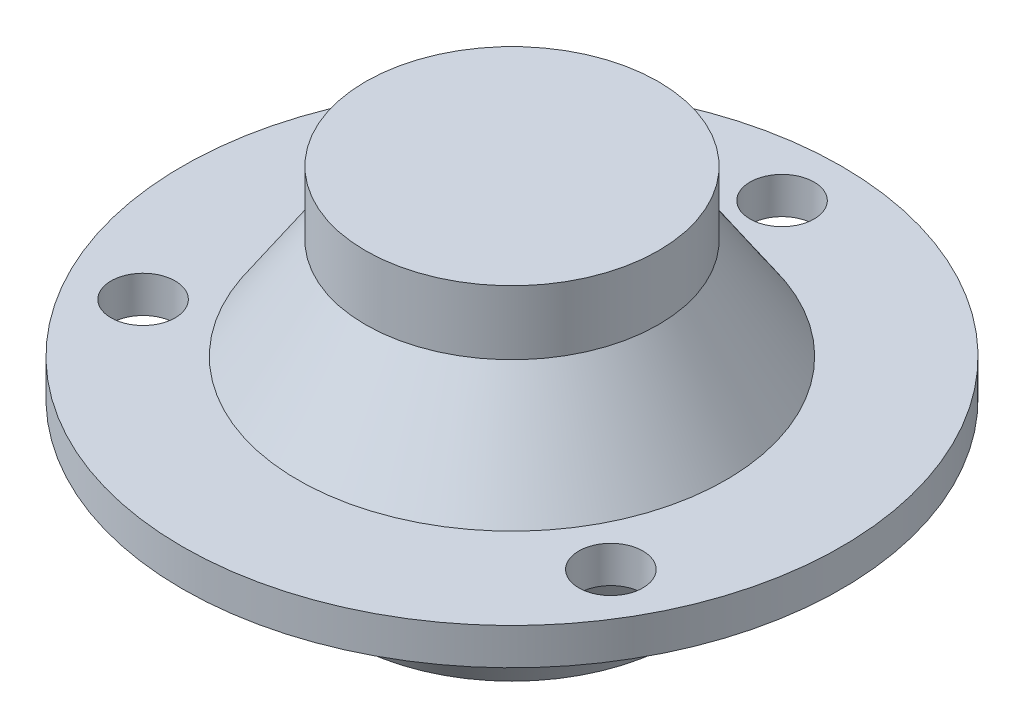
ISO-10303-21;
HEADER;
FILE_DESCRIPTION(('STEP AP214'),'2;1');
FILE_NAME('part.step','',(''),(''),'','','');
FILE_SCHEMA(('AUTOMOTIVE_DESIGN { 1 0 10303 214 1 1 1 1 }'));
ENDSEC;
DATA;
#1=APPLICATION_CONTEXT('core data for automotive mechanical design processes');
#2=APPLICATION_PROTOCOL_DEFINITION('international standard','automotive_design',2000,#1);
#3=PRODUCT_CONTEXT('',#1,'mechanical');
#4=PRODUCT('Part','Part','',(#3));
#5=PRODUCT_RELATED_PRODUCT_CATEGORY('part','',(#4));
#6=PRODUCT_DEFINITION_FORMATION('','',#4);
#7=PRODUCT_DEFINITION_CONTEXT('part definition',#1,'design');
#8=PRODUCT_DEFINITION('design','',#6,#7);
#9=PRODUCT_DEFINITION_SHAPE('','',#8);
#10=(LENGTH_UNIT() NAMED_UNIT(*) SI_UNIT(.MILLI.,.METRE.));
#11=(NAMED_UNIT(*) PLANE_ANGLE_UNIT() SI_UNIT($,.RADIAN.));
#12=(NAMED_UNIT(*) SI_UNIT($,.STERADIAN.) SOLID_ANGLE_UNIT());
#13=UNCERTAINTY_MEASURE_WITH_UNIT(LENGTH_MEASURE(1.E-05),#10,'distance_accuracy_value','');
#14=(GEOMETRIC_REPRESENTATION_CONTEXT(3) GLOBAL_UNCERTAINTY_ASSIGNED_CONTEXT((#13)) GLOBAL_UNIT_ASSIGNED_CONTEXT((#10,
#11,#12)) REPRESENTATION_CONTEXT('',''));
#15=CARTESIAN_POINT('',(0.,0.,0.));
#16=DIRECTION('',(0.,0.,1.));
#17=DIRECTION('',(1.,0.,0.));
#18=AXIS2_PLACEMENT_3D('',#15,#16,#17);
#19=CARTESIAN_POINT('',(9.,-9.,0.));
#20=DIRECTION('',(0.,-1.,0.));
#21=DIRECTION('',(0.,0.,-1.));
#22=AXIS2_PLACEMENT_3D('',#19,#20,#21);
#23=PLANE('',#22);
#24=CARTESIAN_POINT('',(0.,-9.,0.));
#25=DIRECTION('',(0.,-1.,0.));
#26=DIRECTION('',(0.,0.,-1.));
#27=AXIS2_PLACEMENT_3D('',#24,#25,#26);
#28=CIRCLE('',#27,8.);
#29=CARTESIAN_POINT('',(0.,-9.,-8.));
#30=VERTEX_POINT('',#29);
#31=EDGE_CURVE('E51',#30,#30,#28,.F.);
#32=ORIENTED_EDGE('',*,*,#31,.T.);
#33=EDGE_LOOP('',(#32));
#34=FACE_BOUND('',#33,.T.);
#35=CARTESIAN_POINT('',(0.,-9.,0.));
#36=DIRECTION('',(0.,-1.,0.));
#37=DIRECTION('',(0.,0.,-1.));
#38=AXIS2_PLACEMENT_3D('',#35,#36,#37);
#39=CIRCLE('',#38,9.);
#40=CARTESIAN_POINT('',(0.,-9.,-9.));
#41=VERTEX_POINT('',#40);
#42=EDGE_CURVE('E54',#41,#41,#39,.T.);
#43=ORIENTED_EDGE('',*,*,#42,.T.);
#44=EDGE_LOOP('',(#43));
#45=FACE_BOUND('',#44,.T.);
#46=ADVANCED_FACE('F35',(#34,#45),#23,.T.);
#47=CARTESIAN_POINT('',(0.,9.,0.));
#48=DIRECTION('',(0.,1.,0.));
#49=DIRECTION('',(0.,0.,1.));
#50=AXIS2_PLACEMENT_3D('',#47,#48,#49);
#51=PLANE('',#50);
#52=CARTESIAN_POINT('',(0.,9.,0.));
#53=DIRECTION('',(0.,-1.,0.));
#54=DIRECTION('',(0.,0.,-1.));
#55=AXIS2_PLACEMENT_3D('',#52,#53,#54);
#56=CIRCLE('',#55,8.);
#57=CARTESIAN_POINT('',(0.,9.,-8.));
#58=VERTEX_POINT('',#57);
#59=EDGE_CURVE('E10',#58,#58,#56,.T.);
#60=ORIENTED_EDGE('',*,*,#59,.F.);
#61=EDGE_LOOP('',(#60));
#62=FACE_BOUND('',#61,.T.);
#63=ADVANCED_FACE('F102',(#62),#51,.T.);
#64=CARTESIAN_POINT('',(0.,0.,0.));
#65=DIRECTION('',(0.,-1.,0.));
#66=DIRECTION('',(0.,0.,-1.));
#67=AXIS2_PLACEMENT_3D('',#64,#65,#66);
#68=CYLINDRICAL_SURFACE('',#67,8.);
#69=ORIENTED_EDGE('',*,*,#59,.T.);
#70=EDGE_LOOP('',(#69));
#71=FACE_BOUND('',#70,.T.);
#72=CARTESIAN_POINT('',(0.,5.5,0.));
#73=DIRECTION('',(0.,-1.,0.));
#74=DIRECTION('',(0.,0.,-1.));
#75=AXIS2_PLACEMENT_3D('',#72,#73,#74);
#76=CIRCLE('',#75,8.);
#77=CARTESIAN_POINT('',(0.,5.5,-8.));
#78=VERTEX_POINT('',#77);
#79=EDGE_CURVE('E42',#78,#78,#76,.T.);
#80=ORIENTED_EDGE('',*,*,#79,.F.);
#81=EDGE_LOOP('',(#80));
#82=FACE_BOUND('',#81,.T.);
#83=ADVANCED_FACE('F92',(#71,#82),#68,.T.);
#84=CARTESIAN_POINT('',(0.,0.,0.));
#85=DIRECTION('',(0.,-1.,0.));
#86=DIRECTION('',(0.,0.,-1.));
#87=AXIS2_PLACEMENT_3D('',#84,#85,#86);
#88=CONICAL_SURFACE('',#87,11.69,0.590933918434742);
#89=ORIENTED_EDGE('',*,*,#79,.T.);
#90=EDGE_LOOP('',(#89));
#91=FACE_BOUND('',#90,.T.);
#92=CARTESIAN_POINT('',(0.,0.,0.));
#93=DIRECTION('',(0.,-1.,0.));
#94=DIRECTION('',(0.,0.,-1.));
#95=AXIS2_PLACEMENT_3D('',#92,#93,#94);
#96=CIRCLE('',#95,11.69);
#97=CARTESIAN_POINT('',(0.,0.,-11.69));
#98=VERTEX_POINT('',#97);
#99=EDGE_CURVE('E47',#98,#98,#96,.T.);
#100=ORIENTED_EDGE('',*,*,#99,.F.);
#101=EDGE_LOOP('',(#100));
#102=FACE_BOUND('',#101,.T.);
#103=ADVANCED_FACE('F90',(#91,#102),#88,.T.);
#104=CARTESIAN_POINT('',(11.69,0.,0.));
#105=DIRECTION('',(0.,1.,0.));
#106=DIRECTION('',(0.,0.,1.));
#107=AXIS2_PLACEMENT_3D('',#104,#105,#106);
#108=PLANE('',#107);
#109=CARTESIAN_POINT('',(-12.7738747058204,0.,7.37500000000006));
#110=DIRECTION('',(0.,1.,0.));
#111=DIRECTION('',(0.866025403784436,0.,-0.500000000000004));
#112=AXIS2_PLACEMENT_3D('',#109,#110,#111);
#113=CIRCLE('',#112,1.75);
#114=CARTESIAN_POINT('',(-11.2583302491977,0.,6.50000000000006));
#115=VERTEX_POINT('',#114);
#116=EDGE_CURVE('E60',#115,#115,#113,.T.);
#117=ORIENTED_EDGE('',*,*,#116,.F.);
#118=EDGE_LOOP('',(#117));
#119=FACE_BOUND('',#118,.T.);
#120=CARTESIAN_POINT('',(12.7738747058205,0.,7.37499999999988));
#121=DIRECTION('',(0.,1.,0.));
#122=DIRECTION('',(-0.866025403784443,0.,-0.499999999999992));
#123=AXIS2_PLACEMENT_3D('',#120,#121,#122);
#124=CIRCLE('',#123,1.75);
#125=CARTESIAN_POINT('',(11.2583302491978,0.,6.4999999999999));
#126=VERTEX_POINT('',#125);
#127=EDGE_CURVE('E65',#126,#126,#124,.T.);
#128=ORIENTED_EDGE('',*,*,#127,.F.);
#129=EDGE_LOOP('',(#128));
#130=FACE_BOUND('',#129,.T.);
#131=CARTESIAN_POINT('',(0.,0.,-14.75));
#132=DIRECTION('',(0.,1.,0.));
#133=DIRECTION('',(0.,0.,1.));
#134=AXIS2_PLACEMENT_3D('',#131,#132,#133);
#135=CIRCLE('',#134,1.75);
#136=CARTESIAN_POINT('',(0.,0.,-13.));
#137=VERTEX_POINT('',#136);
#138=EDGE_CURVE('E57',#137,#137,#135,.T.);
#139=ORIENTED_EDGE('',*,*,#138,.F.);
#140=EDGE_LOOP('',(#139));
#141=FACE_BOUND('',#140,.T.);
#142=ORIENTED_EDGE('',*,*,#99,.T.);
#143=EDGE_LOOP('',(#142));
#144=FACE_BOUND('',#143,.T.);
#145=CARTESIAN_POINT('',(0.,0.,0.));
#146=DIRECTION('',(0.,-1.,0.));
#147=DIRECTION('',(0.,0.,-1.));
#148=AXIS2_PLACEMENT_3D('',#145,#146,#147);
#149=CIRCLE('',#148,18.);
#150=CARTESIAN_POINT('',(0.,0.,-18.));
#151=VERTEX_POINT('',#150);
#152=EDGE_CURVE('E82',#151,#151,#149,.T.);
#153=ORIENTED_EDGE('',*,*,#152,.F.);
#154=EDGE_LOOP('',(#153));
#155=FACE_BOUND('',#154,.T.);
#156=ADVANCED_FACE('F87',(#119,#130,#141,#144,#155),#108,.T.);
#157=CARTESIAN_POINT('',(0.,0.,0.));
#158=DIRECTION('',(0.,-1.,0.));
#159=DIRECTION('',(0.,0.,-1.));
#160=AXIS2_PLACEMENT_3D('',#157,#158,#159);
#161=CYLINDRICAL_SURFACE('',#160,18.);
#162=ORIENTED_EDGE('',*,*,#152,.T.);
#163=EDGE_LOOP('',(#162));
#164=FACE_BOUND('',#163,.T.);
#165=CARTESIAN_POINT('',(0.,-2.,0.));
#166=DIRECTION('',(0.,-1.,0.));
#167=DIRECTION('',(0.,0.,-1.));
#168=AXIS2_PLACEMENT_3D('',#165,#166,#167);
#169=CIRCLE('',#168,18.);
#170=CARTESIAN_POINT('',(0.,-2.,-18.));
#171=VERTEX_POINT('',#170);
#172=EDGE_CURVE('E79',#171,#171,#169,.T.);
#173=ORIENTED_EDGE('',*,*,#172,.F.);
#174=EDGE_LOOP('',(#173));
#175=FACE_BOUND('',#174,.T.);
#176=ADVANCED_FACE('F99',(#164,#175),#161,.T.);
#177=CARTESIAN_POINT('',(18.,-2.,0.));
#178=DIRECTION('',(0.,-1.,0.));
#179=DIRECTION('',(0.,0.,-1.));
#180=AXIS2_PLACEMENT_3D('',#177,#178,#179);
#181=PLANE('',#180);
#182=CARTESIAN_POINT('',(-12.7738747058204,-2.,7.37500000000006));
#183=DIRECTION('',(0.,-1.,0.));
#184=DIRECTION('',(0.,0.,-1.));
#185=AXIS2_PLACEMENT_3D('',#182,#183,#184);
#186=CIRCLE('',#185,1.75);
#187=CARTESIAN_POINT('',(-12.7738747058204,-2.,5.62500000000006));
#188=VERTEX_POINT('',#187);
#189=EDGE_CURVE('E38',#188,#188,#186,.T.);
#190=ORIENTED_EDGE('',*,*,#189,.F.);
#191=EDGE_LOOP('',(#190));
#192=FACE_BOUND('',#191,.T.);
#193=CARTESIAN_POINT('',(12.7738747058205,-2.,7.37499999999988));
#194=DIRECTION('',(0.,-1.,0.));
#195=DIRECTION('',(0.,0.,-1.));
#196=AXIS2_PLACEMENT_3D('',#193,#194,#195);
#197=CIRCLE('',#196,1.75);
#198=CARTESIAN_POINT('',(12.7738747058205,-2.,5.62499999999988));
#199=VERTEX_POINT('',#198);
#200=EDGE_CURVE('E58',#199,#199,#197,.T.);
#201=ORIENTED_EDGE('',*,*,#200,.F.);
#202=EDGE_LOOP('',(#201));
#203=FACE_BOUND('',#202,.T.);
#204=CARTESIAN_POINT('',(0.,-2.,-14.75));
#205=DIRECTION('',(0.,-1.,0.));
#206=DIRECTION('',(0.,0.,-1.));
#207=AXIS2_PLACEMENT_3D('',#204,#205,#206);
#208=CIRCLE('',#207,1.75);
#209=CARTESIAN_POINT('',(0.,-2.,-16.5));
#210=VERTEX_POINT('',#209);
#211=EDGE_CURVE('E55',#210,#210,#208,.T.);
#212=ORIENTED_EDGE('',*,*,#211,.F.);
#213=EDGE_LOOP('',(#212));
#214=FACE_BOUND('',#213,.T.);
#215=ORIENTED_EDGE('',*,*,#172,.T.);
#216=EDGE_LOOP('',(#215));
#217=FACE_BOUND('',#216,.T.);
#218=CARTESIAN_POINT('',(0.,-2.,0.));
#219=DIRECTION('',(0.,-1.,0.));
#220=DIRECTION('',(0.,0.,-1.));
#221=AXIS2_PLACEMENT_3D('',#218,#219,#220);
#222=CIRCLE('',#221,12.5);
#223=CARTESIAN_POINT('',(0.,-2.,-12.5));
#224=VERTEX_POINT('',#223);
#225=EDGE_CURVE('E76',#224,#224,#222,.T.);
#226=ORIENTED_EDGE('',*,*,#225,.F.);
#227=EDGE_LOOP('',(#226));
#228=FACE_BOUND('',#227,.T.);
#229=ADVANCED_FACE('F117',(#192,#203,#214,#217,#228),#181,.T.);
#230=CARTESIAN_POINT('',(0.,-9.,0.));
#231=DIRECTION('',(0.,1.,0.));
#232=DIRECTION('',(0.,0.,1.));
#233=AXIS2_PLACEMENT_3D('',#230,#231,#232);
#234=CONICAL_SURFACE('',#233,9.,0.463647609000806);
#235=ORIENTED_EDGE('',*,*,#225,.T.);
#236=EDGE_LOOP('',(#235));
#237=FACE_BOUND('',#236,.T.);
#238=ORIENTED_EDGE('',*,*,#42,.F.);
#239=EDGE_LOOP('',(#238));
#240=FACE_BOUND('',#239,.T.);
#241=ADVANCED_FACE('F114',(#237,#240),#234,.T.);
#242=CARTESIAN_POINT('',(0.,-3.,0.));
#243=DIRECTION('',(0.,1.,0.));
#244=DIRECTION('',(-1.,0.,0.));
#245=AXIS2_PLACEMENT_3D('',#242,#243,#244);
#246=SPHERICAL_SURFACE('',#245,10.);
#247=ORIENTED_EDGE('',*,*,#31,.F.);
#248=EDGE_LOOP('',(#247));
#249=FACE_BOUND('',#248,.T.);
#250=ADVANCED_FACE('F116',(#249),#246,.T.);
#251=CARTESIAN_POINT('',(0.,-13.,-14.75));
#252=DIRECTION('',(0.,1.,0.));
#253=DIRECTION('',(0.,0.,1.));
#254=AXIS2_PLACEMENT_3D('',#251,#252,#253);
#255=CYLINDRICAL_SURFACE('',#254,1.75);
#256=ORIENTED_EDGE('',*,*,#211,.T.);
#257=EDGE_LOOP('',(#256));
#258=FACE_BOUND('',#257,.T.);
#259=ORIENTED_EDGE('',*,*,#138,.T.);
#260=EDGE_LOOP('',(#259));
#261=FACE_BOUND('',#260,.T.);
#262=ADVANCED_FACE('F124',(#258,#261),#255,.F.);
#263=CARTESIAN_POINT('',(12.7738747058205,-13.,7.37499999999988));
#264=DIRECTION('',(0.,1.,0.));
#265=DIRECTION('',(0.,0.,1.));
#266=AXIS2_PLACEMENT_3D('',#263,#264,#265);
#267=CYLINDRICAL_SURFACE('',#266,1.75);
#268=ORIENTED_EDGE('',*,*,#200,.T.);
#269=EDGE_LOOP('',(#268));
#270=FACE_BOUND('',#269,.T.);
#271=ORIENTED_EDGE('',*,*,#127,.T.);
#272=EDGE_LOOP('',(#271));
#273=FACE_BOUND('',#272,.T.);
#274=ADVANCED_FACE('F157',(#270,#273),#267,.F.);
#275=CARTESIAN_POINT('',(-12.7738747058204,-13.,7.37500000000006));
#276=DIRECTION('',(0.,1.,0.));
#277=DIRECTION('',(0.,0.,1.));
#278=AXIS2_PLACEMENT_3D('',#275,#276,#277);
#279=CYLINDRICAL_SURFACE('',#278,1.75);
#280=ORIENTED_EDGE('',*,*,#189,.T.);
#281=EDGE_LOOP('',(#280));
#282=FACE_BOUND('',#281,.T.);
#283=ORIENTED_EDGE('',*,*,#116,.T.);
#284=EDGE_LOOP('',(#283));
#285=FACE_BOUND('',#284,.T.);
#286=ADVANCED_FACE('F162',(#282,#285),#279,.F.);
#287=CLOSED_SHELL('',(#46,#63,#83,#103,#156,#176,#229,#241,#250,#262,#274,#286));
#288=MANIFOLD_SOLID_BREP('B2',#287);
#289=ADVANCED_BREP_SHAPE_REPRESENTATION('',(#18,#288),#14);
#290=SHAPE_DEFINITION_REPRESENTATION(#9,#289);
ENDSEC;
END-ISO-10303-21;
